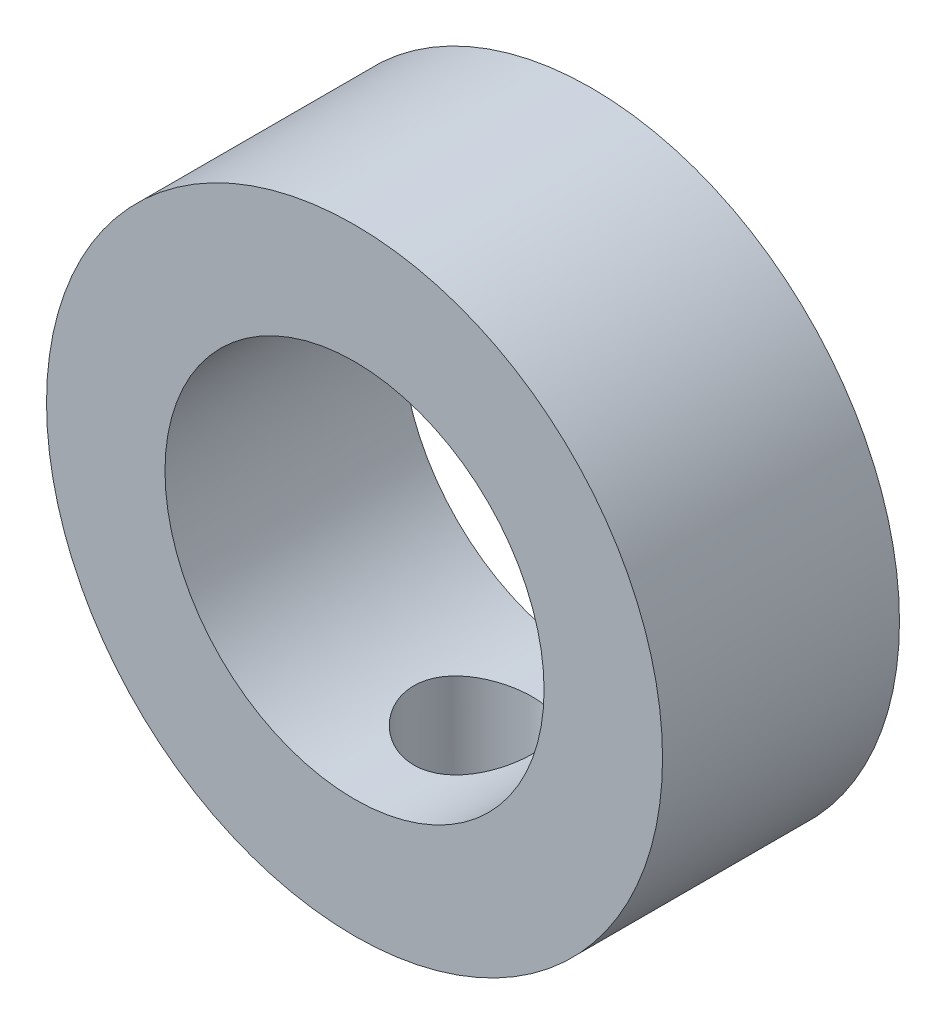
ISO-10303-21;
HEADER;
FILE_DESCRIPTION(('STEP AP214'),'2;1');
FILE_NAME('part.step','',(''),(''),'','','');
FILE_SCHEMA(('AUTOMOTIVE_DESIGN { 1 0 10303 214 1 1 1 1 }'));
ENDSEC;
DATA;
#1=APPLICATION_CONTEXT('core data for automotive mechanical design processes');
#2=APPLICATION_PROTOCOL_DEFINITION('international standard','automotive_design',2000,#1);
#3=PRODUCT_CONTEXT('',#1,'mechanical');
#4=PRODUCT('Part','Part','',(#3));
#5=PRODUCT_RELATED_PRODUCT_CATEGORY('part','',(#4));
#6=PRODUCT_DEFINITION_FORMATION('','',#4);
#7=PRODUCT_DEFINITION_CONTEXT('part definition',#1,'design');
#8=PRODUCT_DEFINITION('design','',#6,#7);
#9=PRODUCT_DEFINITION_SHAPE('','',#8);
#10=(LENGTH_UNIT() NAMED_UNIT(*) SI_UNIT(.MILLI.,.METRE.));
#11=(NAMED_UNIT(*) PLANE_ANGLE_UNIT() SI_UNIT($,.RADIAN.));
#12=(NAMED_UNIT(*) SI_UNIT($,.STERADIAN.) SOLID_ANGLE_UNIT());
#13=UNCERTAINTY_MEASURE_WITH_UNIT(LENGTH_MEASURE(1.E-05),#10,'distance_accuracy_value','');
#14=(GEOMETRIC_REPRESENTATION_CONTEXT(3) GLOBAL_UNCERTAINTY_ASSIGNED_CONTEXT((#13)) GLOBAL_UNIT_ASSIGNED_CONTEXT((#10,
#11,#12)) REPRESENTATION_CONTEXT('',''));
#15=CARTESIAN_POINT('',(0.,0.,0.));
#16=DIRECTION('',(0.,0.,1.));
#17=DIRECTION('',(1.,0.,0.));
#18=AXIS2_PLACEMENT_3D('',#15,#16,#17);
#19=CARTESIAN_POINT('',(0.,0.,5.));
#20=DIRECTION('',(0.,0.,1.));
#21=DIRECTION('',(1.,0.,0.));
#22=AXIS2_PLACEMENT_3D('',#19,#20,#21);
#23=PLANE('',#22);
#24=CARTESIAN_POINT('',(0.,0.,5.));
#25=DIRECTION('',(0.,0.,1.));
#26=DIRECTION('',(1.,0.,0.));
#27=AXIS2_PLACEMENT_3D('',#24,#25,#26);
#28=CIRCLE('',#27,6.5);
#29=CARTESIAN_POINT('',(6.5,0.,5.));
#30=VERTEX_POINT('',#29);
#31=EDGE_CURVE('E10',#30,#30,#28,.T.);
#32=ORIENTED_EDGE('',*,*,#31,.T.);
#33=EDGE_LOOP('',(#32));
#34=FACE_BOUND('',#33,.T.);
#35=CARTESIAN_POINT('',(0.,0.,5.));
#36=DIRECTION('',(0.,0.,1.));
#37=DIRECTION('',(1.,0.,0.));
#38=AXIS2_PLACEMENT_3D('',#35,#36,#37);
#39=CIRCLE('',#38,4.);
#40=CARTESIAN_POINT('',(4.,0.,5.));
#41=VERTEX_POINT('',#40);
#42=EDGE_CURVE('E56',#41,#41,#39,.T.);
#43=ORIENTED_EDGE('',*,*,#42,.F.);
#44=EDGE_LOOP('',(#43));
#45=FACE_BOUND('',#44,.T.);
#46=ADVANCED_FACE('F37',(#34,#45),#23,.T.);
#47=CARTESIAN_POINT('',(0.,0.,0.));
#48=DIRECTION('',(0.,0.,1.));
#49=DIRECTION('',(1.,0.,0.));
#50=AXIS2_PLACEMENT_3D('',#47,#48,#49);
#51=PLANE('',#50);
#52=CARTESIAN_POINT('',(0.,0.,0.));
#53=DIRECTION('',(0.,0.,1.));
#54=DIRECTION('',(1.,0.,0.));
#55=AXIS2_PLACEMENT_3D('',#52,#53,#54);
#56=CIRCLE('',#55,6.5);
#57=CARTESIAN_POINT('',(6.5,0.,0.));
#58=VERTEX_POINT('',#57);
#59=EDGE_CURVE('E51',#58,#58,#56,.T.);
#60=ORIENTED_EDGE('',*,*,#59,.F.);
#61=EDGE_LOOP('',(#60));
#62=FACE_BOUND('',#61,.T.);
#63=CARTESIAN_POINT('',(0.,0.,0.));
#64=DIRECTION('',(0.,0.,1.));
#65=DIRECTION('',(1.,0.,0.));
#66=AXIS2_PLACEMENT_3D('',#63,#64,#65);
#67=CIRCLE('',#66,4.);
#68=CARTESIAN_POINT('',(4.,0.,0.));
#69=VERTEX_POINT('',#68);
#70=EDGE_CURVE('E58',#69,#69,#67,.T.);
#71=ORIENTED_EDGE('',*,*,#70,.T.);
#72=EDGE_LOOP('',(#71));
#73=FACE_BOUND('',#72,.T.);
#74=ADVANCED_FACE('F79',(#62,#73),#51,.F.);
#75=CARTESIAN_POINT('',(0.,0.,5.));
#76=DIRECTION('',(0.,0.,-1.));
#77=DIRECTION('',(-1.,0.,0.));
#78=AXIS2_PLACEMENT_3D('',#75,#76,#77);
#79=CYLINDRICAL_SURFACE('',#78,6.5);
#80=CARTESIAN_POINT('',(0.,-6.5,3.75));
#81=CARTESIAN_POINT('',(0.0695263300903768,-6.49999873054918,3.74999737939015));
#82=CARTESIAN_POINT('',(0.139086386536077,-6.49887299034978,3.744179706351));
#83=CARTESIAN_POINT('',(0.27624406654568,-6.49449072478032,3.72107902756889));
#84=CARTESIAN_POINT('',(0.343840022447299,-6.49123244093525,3.70378655965699));
#85=CARTESIAN_POINT('',(0.475066268731186,-6.48294932466697,3.65828720975593));
#86=CARTESIAN_POINT('',(0.538700159856868,-6.47792612463065,3.63009041086318));
#87=CARTESIAN_POINT('',(0.660328619211792,-6.46666077439192,3.56361193603687));
#88=CARTESIAN_POINT('',(0.718323597744222,-6.46041871297687,3.52533099460691));
#89=CARTESIAN_POINT('',(0.82776216487111,-6.44731615012176,3.43926041714611));
#90=CARTESIAN_POINT('',(0.87912464768377,-6.44044947743084,3.39136858427445));
#91=CARTESIAN_POINT('',(0.973138343078083,-6.42691706808667,3.28765548140267));
#92=CARTESIAN_POINT('',(1.01578890972676,-6.42025134636388,3.23183362396171));
#93=CARTESIAN_POINT('',(1.09150839810311,-6.4078154700976,3.1132680023211));
#94=CARTESIAN_POINT('',(1.12449425725113,-6.40205326632547,3.05047028444983));
#95=CARTESIAN_POINT('',(1.17941610157594,-6.39216406280365,2.92009504498672));
#96=CARTESIAN_POINT('',(1.20135309167639,-6.38803691434868,2.85251795872879));
#97=CARTESIAN_POINT('',(1.23329305228569,-6.38194735063818,2.71537190414041));
#98=CARTESIAN_POINT('',(1.24343779395771,-6.37995924110286,2.64583711665146));
#99=CARTESIAN_POINT('',(1.2519454509238,-6.37829543879725,2.50602618154001));
#100=CARTESIAN_POINT('',(1.25030947843596,-6.3786195277321,2.43575010452821));
#101=CARTESIAN_POINT('',(1.23541697804277,-6.38152012920898,2.29748238841896));
#102=CARTESIAN_POINT('',(1.22232215325027,-6.38406529733108,2.22947257761762));
#103=CARTESIAN_POINT('',(1.18513854067889,-6.39107200195107,2.09663350844221));
#104=CARTESIAN_POINT('',(1.16104926380166,-6.39553362370363,2.03180439170637));
#105=CARTESIAN_POINT('',(1.10240382729656,-6.40590301761788,1.90669652809025));
#106=CARTESIAN_POINT('',(1.06778282798614,-6.41181970353635,1.846448944746));
#107=CARTESIAN_POINT('',(0.989102525446738,-6.42442673553149,1.73255751443071));
#108=CARTESIAN_POINT('',(0.945042216343233,-6.43111716402495,1.67891437220416));
#109=CARTESIAN_POINT('',(0.847864455663339,-6.44465411904849,1.57882073288959));
#110=CARTESIAN_POINT('',(0.794608805779965,-6.45150139326972,1.5325044049816));
#111=CARTESIAN_POINT('',(0.681013328076993,-6.46447860514488,1.44944224634974));
#112=CARTESIAN_POINT('',(0.620673422062239,-6.47060853487937,1.41269652127943));
#113=CARTESIAN_POINT('',(0.494478881244397,-6.48147374305158,1.34979697648017));
#114=CARTESIAN_POINT('',(0.428616856521534,-6.48620711303174,1.32365763269142));
#115=CARTESIAN_POINT('',(0.293325284598557,-6.49373123608211,1.28285128832655));
#116=CARTESIAN_POINT('',(0.223896137321169,-6.4965222064135,1.2681830046674));
#117=CARTESIAN_POINT('',(0.0845949575723082,-6.4998170641524,1.25092311692321));
#118=CARTESIAN_POINT('',(0.0147464889976594,-6.50035574677272,1.24814776407948));
#119=CARTESIAN_POINT('',(-0.124416318296412,-6.49918164994221,1.25425888859832));
#120=CARTESIAN_POINT('',(-0.193730684493375,-6.497468987103,1.26314476195117));
#121=CARTESIAN_POINT('',(-0.329271121290111,-6.49200634359787,1.29217337199752));
#122=CARTESIAN_POINT('',(-0.395517951862497,-6.48827328656802,1.31222263921288));
#123=CARTESIAN_POINT('',(-0.523709778000948,-6.47918677244289,1.36290739006222));
#124=CARTESIAN_POINT('',(-0.58565446945985,-6.47383320094063,1.39354362114864));
#125=CARTESIAN_POINT('',(-0.704264341336229,-6.4620127326735,1.46493587158737));
#126=CARTESIAN_POINT('',(-0.760861092631656,-6.4555338112679,1.5058035457684));
#127=CARTESIAN_POINT('',(-0.866459302715517,-6.44221127589378,1.59634811174868));
#128=CARTESIAN_POINT('',(-0.915460011904465,-6.43536762602225,1.64602587191698));
#129=CARTESIAN_POINT('',(-1.00517755082431,-6.42197081919612,1.75361408069802));
#130=CARTESIAN_POINT('',(-1.04576869619256,-6.41542307578637,1.81163012514148));
#131=CARTESIAN_POINT('',(-1.11662974416659,-6.40347051879715,1.93376516213667));
#132=CARTESIAN_POINT('',(-1.14690004216187,-6.39806566143697,1.99788392077428));
#133=CARTESIAN_POINT('',(-1.19608442093859,-6.3890537865887,2.13009317947312));
#134=CARTESIAN_POINT('',(-1.21505488797639,-6.385437857926,2.19816206673377));
#135=CARTESIAN_POINT('',(-1.24127395271723,-6.38039343660705,2.33659753660325));
#136=CARTESIAN_POINT('',(-1.24852394995944,-6.37896468278173,2.4069638438537));
#137=CARTESIAN_POINT('',(-1.25104755843674,-6.37847010253234,2.54673667796078));
#138=CARTESIAN_POINT('',(-1.24651955106104,-6.37936513521924,2.61613956148371));
#139=CARTESIAN_POINT('',(-1.22605133269021,-6.38333023983079,2.7531749722532));
#140=CARTESIAN_POINT('',(-1.21011119845593,-6.38640029712568,2.82080751140438));
#141=CARTESIAN_POINT('',(-1.16735673858749,-6.39435266298136,2.95226830992101));
#142=CARTESIAN_POINT('',(-1.14056497100194,-6.39923121033494,3.01610414795882));
#143=CARTESIAN_POINT('',(-1.07688985392764,-6.4102533266987,3.13840618094546));
#144=CARTESIAN_POINT('',(-1.04000574067459,-6.41639699144119,3.19687196905446));
#145=CARTESIAN_POINT('',(-0.956507819072143,-6.42937795151368,3.30776578734231));
#146=CARTESIAN_POINT('',(-0.909750049269227,-6.43622463982555,3.36008434074107));
#147=CARTESIAN_POINT('',(-0.808131192425044,-6.44977101580728,3.45619868774715));
#148=CARTESIAN_POINT('',(-0.753268246630374,-6.45647066935191,3.49999252103405));
#149=CARTESIAN_POINT('',(-0.636368128673317,-6.46904328529454,3.57820650842778));
#150=CARTESIAN_POINT('',(-0.57426746743471,-6.47490774506217,3.61253318503457));
#151=CARTESIAN_POINT('',(-0.445086129675207,-6.48506595383496,3.67021039618203));
#152=CARTESIAN_POINT('',(-0.378010126647428,-6.48936115496814,3.69357108393445));
#153=CARTESIAN_POINT('',(-0.258961782852772,-6.49503671875109,3.72399229210729));
#154=CARTESIAN_POINT('',(-0.207678719850838,-6.49688729501668,3.73372824487617));
#155=CARTESIAN_POINT('',(-0.104270079257342,-6.49936939476943,3.74673299181852));
#156=CARTESIAN_POINT('',(-0.0521445250851634,-6.50000095208405,3.75000196544901));
#157=CARTESIAN_POINT('',(0.,-6.5,3.75));
#158=B_SPLINE_CURVE_WITH_KNOTS('',3,(#80,#81,#82,#83,#84,#85,#86,#87,#88,#89,#90,#91,#92,#93,
#94,#95,#96,#97,#98,#99,#100,#101,#102,#103,#104,#105,#106,#107,#108,#109,#110,#111,#112,#113,
#114,#115,#116,#117,#118,#119,#120,#121,#122,#123,#124,#125,#126,#127,#128,#129,#130,#131,#132,
#133,#134,#135,#136,#137,#138,#139,#140,#141,#142,#143,#144,#145,#146,#147,#148,#149,#150,#151,
#152,#153,#154,#155,#156,#157),.UNSPECIFIED.,.T.,.F.,(4,2,2,2,2,2,2,2,2,2,2,2,2,2,2,2,2,2,2,2,2,
2,2,2,2,2,2,2,2,2,2,2,2,2,2,2,2,2,4),(0.,0.208388270286286,0.416948592398258,0.625316520786646,
0.833669276372911,1.0443676620205,1.25508166394262,1.46755680912121,1.68001262563574,
1.88988689492414,2.09974135022729,2.3066813234972,2.51363050358034,2.72188049935154,
2.9301526977684,3.14188196787827,3.35361357524978,3.56563319670022,3.77762909953165,
3.98633752849765,4.19503514754155,4.40201109247083,4.60900165313827,4.81835785477028,
5.0277347031462,5.24004512383251,5.45234741003696,5.66358123272488,5.87478983015679,
6.08246408561773,6.29013694422222,6.49738029642496,6.70463933664288,6.91515952159825,
7.12572806013492,7.33830680136692,7.55068832965364,7.70698320273414,7.8632737386113),.UNSPECIFIED.);
#159=CARTESIAN_POINT('',(0.,-6.5,3.75));
#160=VERTEX_POINT('',#159);
#161=EDGE_CURVE('E61',#160,#160,#158,.T.);
#162=ORIENTED_EDGE('',*,*,#161,.T.);
#163=EDGE_LOOP('',(#162));
#164=FACE_BOUND('',#163,.T.);
#165=ORIENTED_EDGE('',*,*,#31,.F.);
#166=EDGE_LOOP('',(#165));
#167=FACE_BOUND('',#166,.T.);
#168=ORIENTED_EDGE('',*,*,#59,.T.);
#169=EDGE_LOOP('',(#168));
#170=FACE_BOUND('',#169,.T.);
#171=ADVANCED_FACE('F39',(#164,#167,#170),#79,.T.);
#172=CARTESIAN_POINT('',(0.,0.,5.));
#173=DIRECTION('',(0.,0.,-1.));
#174=DIRECTION('',(-1.,0.,0.));
#175=AXIS2_PLACEMENT_3D('',#172,#173,#174);
#176=CYLINDRICAL_SURFACE('',#175,4.);
#177=CARTESIAN_POINT('',(0.,-4.,3.75));
#178=CARTESIAN_POINT('',(0.0684391851745465,-3.99999965877989,3.74999955341242));
#179=CARTESIAN_POINT('',(0.136883052502859,-3.99822694984841,3.74436077305555));
#180=CARTESIAN_POINT('',(0.271769209588448,-3.99132894088807,3.72201375846076));
#181=CARTESIAN_POINT('',(0.338211042725907,-3.9862028819986,3.70530301863564));
#182=CARTESIAN_POINT('',(0.467128543650807,-3.97315815697909,3.66143062880426));
#183=CARTESIAN_POINT('',(0.529610176985804,-3.96524381499025,3.63428515534703));
#184=CARTESIAN_POINT('',(0.64913480234646,-3.94743969161093,3.57038268232167));
#185=CARTESIAN_POINT('',(0.706176935444885,-3.93754959899905,3.53362416821941));
#186=CARTESIAN_POINT('',(0.814965334952281,-3.91650213740282,3.45034400798264));
#187=CARTESIAN_POINT('',(0.86652002815666,-3.90531715926989,3.40357911493893));
#188=CARTESIAN_POINT('',(0.961197382036994,-3.88310046374208,3.30213160758645));
#189=CARTESIAN_POINT('',(1.0043184728987,-3.87206877523457,3.24744752250545));
#190=CARTESIAN_POINT('',(1.08194336483114,-3.85111144698172,3.13005543619192));
#191=CARTESIAN_POINT('',(1.11620784150129,-3.84121988301796,3.06718252247278));
#192=CARTESIAN_POINT('',(1.17359741076672,-3.82407801799234,2.93620768501813));
#193=CARTESIAN_POINT('',(1.19672543771945,-3.81682702128688,2.86810714420607));
#194=CARTESIAN_POINT('',(1.23048459930033,-3.80607606984501,2.73077192254794));
#195=CARTESIAN_POINT('',(1.24147110007865,-3.80246972929508,2.66163315636115));
#196=CARTESIAN_POINT('',(1.25174555036988,-3.7991005514095,2.52240688108811));
#197=CARTESIAN_POINT('',(1.25103660995772,-3.79933669227334,2.45231962917834));
#198=CARTESIAN_POINT('',(1.23821824732739,-3.80353189075438,2.31612553973102));
#199=CARTESIAN_POINT('',(1.22656057869383,-3.80734341745949,2.24997087413843));
#200=CARTESIAN_POINT('',(1.19290813355626,-3.81802025652489,2.12060784346265));
#201=CARTESIAN_POINT('',(1.17091225844551,-3.82488589343115,2.0573997922912));
#202=CARTESIAN_POINT('',(1.11688874681277,-3.84101044014297,1.93464805556736));
#203=CARTESIAN_POINT('',(1.08471925662082,-3.85030284660824,1.87517138930802));
#204=CARTESIAN_POINT('',(1.01136020737848,-3.8702185658007,1.76231223212088));
#205=CARTESIAN_POINT('',(0.970168305215773,-3.88084222394551,1.70893132974629));
#206=CARTESIAN_POINT('',(0.877716954182124,-3.90281527800493,1.60722505658301));
#207=CARTESIAN_POINT('',(0.826084570592817,-3.91417569605696,1.55924044222032));
#208=CARTESIAN_POINT('',(0.715364408095531,-3.9359157075958,1.47252810642032));
#209=CARTESIAN_POINT('',(0.656276077349021,-3.94629522838372,1.43380107078079));
#210=CARTESIAN_POINT('',(0.531664610465454,-3.96501294890191,1.36647231139872));
#211=CARTESIAN_POINT('',(0.466094906919279,-3.97333460648208,1.33795186453603));
#212=CARTESIAN_POINT('',(0.330767977782644,-3.98687955828554,1.29244699914843));
#213=CARTESIAN_POINT('',(0.261012030724608,-3.99210379325151,1.2754590777616));
#214=CARTESIAN_POINT('',(0.122185157290345,-3.99871389395014,1.25408195742102));
#215=CARTESIAN_POINT('',(0.0531918487888419,-4.00024022895439,1.24923145640648));
#216=CARTESIAN_POINT('',(-0.0846303057325852,-3.99969799730981,1.25096622663733));
#217=CARTESIAN_POINT('',(-0.153459174306506,-3.99762995581125,1.2575498273226));
#218=CARTESIAN_POINT('',(-0.287219332975852,-3.99022363769772,1.28159559260639));
#219=CARTESIAN_POINT('',(-0.352204978420948,-3.98496793110725,1.29878326761252));
#220=CARTESIAN_POINT('',(-0.478351928861366,-3.97180121379252,1.34321435236669));
#221=CARTESIAN_POINT('',(-0.539512760449016,-3.96388987514203,1.37045900402491));
#222=CARTESIAN_POINT('',(-0.657932406672232,-3.94598542759568,1.43497321654879));
#223=CARTESIAN_POINT('',(-0.715059739787955,-3.9359462681821,1.47247098749722));
#224=CARTESIAN_POINT('',(-0.822365850960096,-3.91493410002887,1.55615321011702));
#225=CARTESIAN_POINT('',(-0.872542738043336,-3.90396083845862,1.60234001774311));
#226=CARTESIAN_POINT('',(-0.966587462919657,-3.88176994885247,1.70425889005369));
#227=CARTESIAN_POINT('',(-1.01012652339774,-3.87055986714446,1.76029666374526));
#228=CARTESIAN_POINT('',(-1.08721250244909,-3.84961947087602,1.87912661637074));
#229=CARTESIAN_POINT('',(-1.12075957972524,-3.839889132814,1.94191868800443));
#230=CARTESIAN_POINT('',(-1.17670083481141,-3.82311782360754,2.07234517288586));
#231=CARTESIAN_POINT('',(-1.19913819558886,-3.81606646468027,2.1399596495047));
#232=CARTESIAN_POINT('',(-1.23222894320964,-3.80551170941212,2.2782724933238));
#233=CARTESIAN_POINT('',(-1.2428868141461,-3.80200696302675,2.34896967637131));
#234=CARTESIAN_POINT('',(-1.2517940615754,-3.79908292712494,2.48800408755424));
#235=CARTESIAN_POINT('',(-1.25058279621957,-3.79948604683077,2.55630345381293));
#236=CARTESIAN_POINT('',(-1.23708818129474,-3.80390090472383,2.69167458491918));
#237=CARTESIAN_POINT('',(-1.22480534822559,-3.80791247457319,2.758746406884));
#238=CARTESIAN_POINT('',(-1.18987729913378,-3.81896814158112,2.88879403960178));
#239=CARTESIAN_POINT('',(-1.16738642405944,-3.82596698183474,2.95181544109601));
#240=CARTESIAN_POINT('',(-1.11280227335064,-3.84219704261348,3.07324041353135));
#241=CARTESIAN_POINT('',(-1.08070704444254,-3.85142871716522,3.13164304207768));
#242=CARTESIAN_POINT('',(-1.00635675013475,-3.8715348703158,3.24464597044057));
#243=CARTESIAN_POINT('',(-0.963753335241274,-3.88245948922441,3.29900812950044));
#244=CARTESIAN_POINT('',(-0.870208996404849,-3.90448998821726,3.3999863281118));
#245=CARTESIAN_POINT('',(-0.819265842344403,-3.91559591606795,3.44660028899101));
#246=CARTESIAN_POINT('',(-0.708486662823332,-3.93717271952329,3.53228253836299));
#247=CARTESIAN_POINT('',(-0.64841457448738,-3.94761101730634,3.57105473644997));
#248=CARTESIAN_POINT('',(-0.522279138013654,-3.96626769296916,3.63789891513944));
#249=CARTESIAN_POINT('',(-0.45621815779545,-3.97448694315832,3.66597510214183));
#250=CARTESIAN_POINT('',(-0.325747635373978,-3.98720650733461,3.70859136760847));
#251=CARTESIAN_POINT('',(-0.261670337112546,-3.99196240806139,3.72407486730534));
#252=CARTESIAN_POINT('',(-0.131729895440248,-3.99835900340486,3.74477835996771));
#253=CARTESIAN_POINT('',(-0.0658671161396749,-4.00000032839644,3.750000429804));
#254=CARTESIAN_POINT('',(0.,-4.,3.75));
#255=B_SPLINE_CURVE_WITH_KNOTS('',3,(#177,#178,#179,#180,#181,#182,#183,#184,#185,#186,#187,
#188,#189,#190,#191,#192,#193,#194,#195,#196,#197,#198,#199,#200,#201,#202,#203,#204,#205,#206,
#207,#208,#209,#210,#211,#212,#213,#214,#215,#216,#217,#218,#219,#220,#221,#222,#223,#224,#225,
#226,#227,#228,#229,#230,#231,#232,#233,#234,#235,#236,#237,#238,#239,#240,#241,#242,#243,#244,
#245,#246,#247,#248,#249,#250,#251,#252,#253,#254),.UNSPECIFIED.,.T.,.F.,(4,2,2,2,2,2,2,2,2,2,2,
2,2,2,2,2,2,2,2,2,2,2,2,2,2,2,2,2,2,2,2,2,2,2,2,2,2,2,4),(0.,0.20507544943251,0.410197323349067,
0.615002479202437,0.819839921558391,1.03037822195158,1.24095567431276,1.45673771247494,
1.67246286279527,1.8816915016721,2.09086450295138,2.29176917422169,2.49269519979063,
2.69655642720545,2.90047066010359,3.113667472796,3.32688007413303,3.5417546068977,
3.75656384494554,3.96307568548238,4.16955735649363,4.37090626722872,4.572280050345,
4.77856324738343,4.98490245709259,5.1994177871314,5.41392970983712,5.62760115751031,
5.84119123892431,6.04512203476054,6.24904331751085,6.44997913396671,6.65095584330174,
6.85979514006362,7.06869037373341,7.28440668126413,7.50003806666338,7.69744636651541,
7.89481470763048),.UNSPECIFIED.);
#256=CARTESIAN_POINT('',(0.,-4.,3.75));
#257=VERTEX_POINT('',#256);
#258=EDGE_CURVE('E42',#257,#257,#255,.T.);
#259=ORIENTED_EDGE('',*,*,#258,.F.);
#260=EDGE_LOOP('',(#259));
#261=FACE_BOUND('',#260,.T.);
#262=ORIENTED_EDGE('',*,*,#42,.T.);
#263=EDGE_LOOP('',(#262));
#264=FACE_BOUND('',#263,.T.);
#265=ORIENTED_EDGE('',*,*,#70,.F.);
#266=EDGE_LOOP('',(#265));
#267=FACE_BOUND('',#266,.T.);
#268=ADVANCED_FACE('F71',(#261,#264,#267),#176,.F.);
#269=CARTESIAN_POINT('',(0.,-6.5,2.5));
#270=DIRECTION('',(0.,1.,0.));
#271=DIRECTION('',(0.,0.,1.));
#272=AXIS2_PLACEMENT_3D('',#269,#270,#271);
#273=CYLINDRICAL_SURFACE('',#272,1.25);
#274=ORIENTED_EDGE('',*,*,#258,.T.);
#275=EDGE_LOOP('',(#274));
#276=FACE_BOUND('',#275,.T.);
#277=ORIENTED_EDGE('',*,*,#161,.F.);
#278=EDGE_LOOP('',(#277));
#279=FACE_BOUND('',#278,.T.);
#280=ADVANCED_FACE('F68',(#276,#279),#273,.F.);
#281=CLOSED_SHELL('',(#46,#74,#171,#268,#280));
#282=MANIFOLD_SOLID_BREP('B2',#281);
#283=ADVANCED_BREP_SHAPE_REPRESENTATION('',(#18,#282),#14);
#284=SHAPE_DEFINITION_REPRESENTATION(#9,#283);
ENDSEC;
END-ISO-10303-21;
